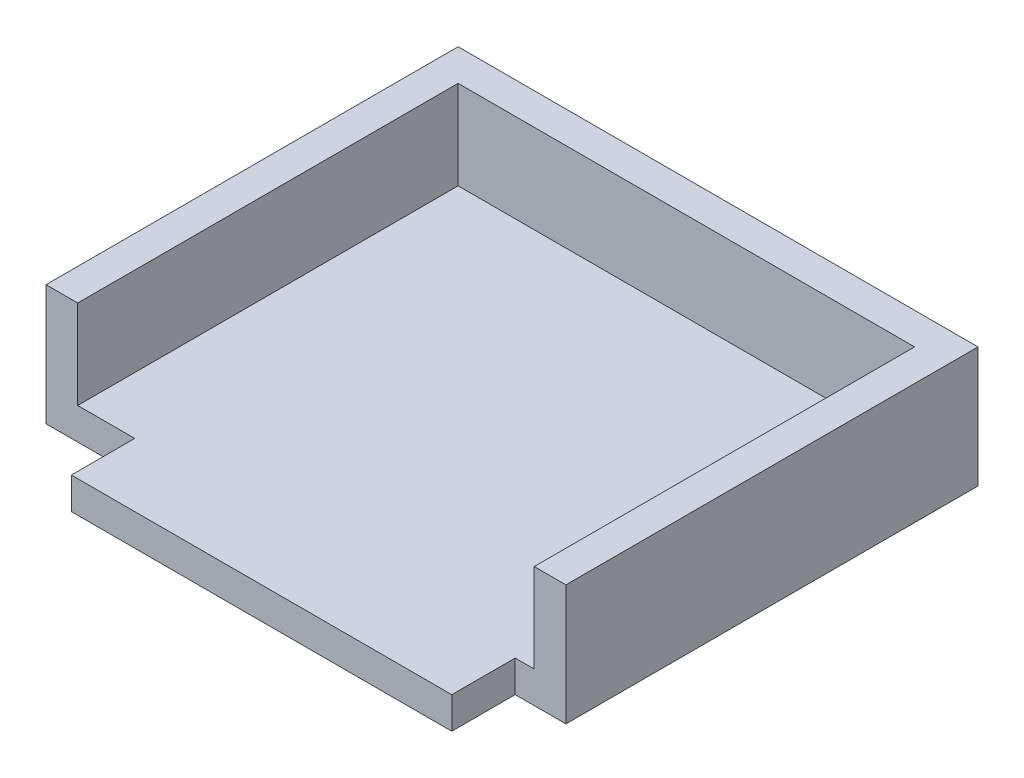
ISO-10303-21;
HEADER;
FILE_DESCRIPTION(('STEP AP214'),'2;1');
FILE_NAME('part.step','',(''),(''),'','','');
FILE_SCHEMA(('AUTOMOTIVE_DESIGN { 1 0 10303 214 1 1 1 1 }'));
ENDSEC;
DATA;
#1=APPLICATION_CONTEXT('core data for automotive mechanical design processes');
#2=APPLICATION_PROTOCOL_DEFINITION('international standard','automotive_design',2000,#1);
#3=PRODUCT_CONTEXT('',#1,'mechanical');
#4=PRODUCT('Part','Part','',(#3));
#5=PRODUCT_RELATED_PRODUCT_CATEGORY('part','',(#4));
#6=PRODUCT_DEFINITION_FORMATION('','',#4);
#7=PRODUCT_DEFINITION_CONTEXT('part definition',#1,'design');
#8=PRODUCT_DEFINITION('design','',#6,#7);
#9=PRODUCT_DEFINITION_SHAPE('','',#8);
#10=(LENGTH_UNIT() NAMED_UNIT(*) SI_UNIT(.MILLI.,.METRE.));
#11=(NAMED_UNIT(*) PLANE_ANGLE_UNIT() SI_UNIT($,.RADIAN.));
#12=(NAMED_UNIT(*) SI_UNIT($,.STERADIAN.) SOLID_ANGLE_UNIT());
#13=UNCERTAINTY_MEASURE_WITH_UNIT(LENGTH_MEASURE(1.E-05),#10,'distance_accuracy_value','');
#14=(GEOMETRIC_REPRESENTATION_CONTEXT(3) GLOBAL_UNCERTAINTY_ASSIGNED_CONTEXT((#13)) GLOBAL_UNIT_ASSIGNED_CONTEXT((#10,
#11,#12)) REPRESENTATION_CONTEXT('',''));
#15=CARTESIAN_POINT('',(0.,0.,0.));
#16=DIRECTION('',(0.,0.,1.));
#17=DIRECTION('',(1.,0.,0.));
#18=AXIS2_PLACEMENT_3D('',#15,#16,#17);
#19=CARTESIAN_POINT('',(-69.1914866211674,5.,-21.8318265199161));
#20=DIRECTION('',(1.,0.,0.));
#21=DIRECTION('',(0.,0.,-1.));
#22=AXIS2_PLACEMENT_3D('',#19,#20,#21);
#23=PLANE('',#22);
#24=DIRECTION('',(0.,0.,1.));
#25=VECTOR('',#24,1.);
#26=CARTESIAN_POINT('',(-69.1914866211674,0.,-21.8318265199161));
#27=LINE('',#26,#25);
#28=CARTESIAN_POINT('',(-69.1914866211674,0.,-21.8318265199161));
#29=VERTEX_POINT('',#28);
#30=CARTESIAN_POINT('',(-69.1914866211674,0.,43.1681734800839));
#31=VERTEX_POINT('',#30);
#32=EDGE_CURVE('E181',#29,#31,#27,.T.);
#33=ORIENTED_EDGE('',*,*,#32,.T.);
#34=DIRECTION('',(0.,-1.,0.));
#35=VECTOR('',#34,1.);
#36=CARTESIAN_POINT('',(-69.1914866211674,5.,43.1681734800839));
#37=LINE('',#36,#35);
#38=CARTESIAN_POINT('',(-69.1914866211674,19.,43.1681734800839));
#39=VERTEX_POINT('',#38);
#40=EDGE_CURVE('E11',#39,#31,#37,.T.);
#41=ORIENTED_EDGE('',*,*,#40,.F.);
#42=DIRECTION('',(0.,0.,1.));
#43=VECTOR('',#42,1.);
#44=CARTESIAN_POINT('',(-69.1914866211674,19.,-21.8318265199161));
#45=LINE('',#44,#43);
#46=CARTESIAN_POINT('',(-69.1914866211674,19.,-21.8318265199161));
#47=VERTEX_POINT('',#46);
#48=EDGE_CURVE('E151',#47,#39,#45,.T.);
#49=ORIENTED_EDGE('',*,*,#48,.F.);
#50=DIRECTION('',(0.,-1.,0.));
#51=VECTOR('',#50,1.);
#52=CARTESIAN_POINT('',(-69.1914866211674,5.,-21.8318265199161));
#53=LINE('',#52,#51);
#54=EDGE_CURVE('E194',#47,#29,#53,.T.);
#55=ORIENTED_EDGE('',*,*,#54,.T.);
#56=EDGE_LOOP('',(#33,#41,#49,#55));
#57=FACE_BOUND('',#56,.T.);
#58=ADVANCED_FACE('F31',(#57),#23,.F.);
#59=CARTESIAN_POINT('',(-69.1914866211674,5.,43.1681734800839));
#60=DIRECTION('',(0.,0.,-1.));
#61=DIRECTION('',(-1.,0.,0.));
#62=AXIS2_PLACEMENT_3D('',#59,#60,#61);
#63=PLANE('',#62);
#64=DIRECTION('',(1.,0.,0.));
#65=VECTOR('',#64,1.);
#66=CARTESIAN_POINT('',(-69.1914866211674,0.,43.1681734800839));
#67=LINE('',#66,#65);
#68=CARTESIAN_POINT('',(-55.1914866211673,0.,43.1681734800839));
#69=VERTEX_POINT('',#68);
#70=EDGE_CURVE('E202',#31,#69,#67,.T.);
#71=ORIENTED_EDGE('',*,*,#70,.T.);
#72=DIRECTION('',(0.,-1.,0.));
#73=VECTOR('',#72,1.);
#74=CARTESIAN_POINT('',(-55.1914866211673,5.,43.1681734800839));
#75=LINE('',#74,#73);
#76=CARTESIAN_POINT('',(-55.1914866211673,5.,43.1681734800839));
#77=VERTEX_POINT('',#76);
#78=EDGE_CURVE('E39',#77,#69,#75,.T.);
#79=ORIENTED_EDGE('',*,*,#78,.F.);
#80=DIRECTION('',(1.,0.,0.));
#81=VECTOR('',#80,1.);
#82=CARTESIAN_POINT('',(-69.1914866211674,5.,43.1681734800839));
#83=LINE('',#82,#81);
#84=CARTESIAN_POINT('',(-64.1914866211673,5.,43.1681734800839));
#85=VERTEX_POINT('',#84);
#86=EDGE_CURVE('E188',#85,#77,#83,.T.);
#87=ORIENTED_EDGE('',*,*,#86,.F.);
#88=DIRECTION('',(0.,-1.,0.));
#89=VECTOR('',#88,1.);
#90=CARTESIAN_POINT('',(-64.1914866211673,19.,43.1681734800839));
#91=LINE('',#90,#89);
#92=CARTESIAN_POINT('',(-64.1914866211673,19.,43.1681734800839));
#93=VERTEX_POINT('',#92);
#94=EDGE_CURVE('E176',#93,#85,#91,.T.);
#95=ORIENTED_EDGE('',*,*,#94,.F.);
#96=DIRECTION('',(1.,0.,0.));
#97=VECTOR('',#96,1.);
#98=CARTESIAN_POINT('',(-69.1914866211674,19.,43.1681734800839));
#99=LINE('',#98,#97);
#100=EDGE_CURVE('E154',#39,#93,#99,.T.);
#101=ORIENTED_EDGE('',*,*,#100,.F.);
#102=ORIENTED_EDGE('',*,*,#40,.T.);
#103=EDGE_LOOP('',(#71,#79,#87,#95,#101,#102));
#104=FACE_BOUND('',#103,.T.);
#105=ADVANCED_FACE('F249',(#104),#63,.F.);
#106=CARTESIAN_POINT('',(-55.1914866211673,5.,43.1681734800839));
#107=DIRECTION('',(1.,0.,0.));
#108=DIRECTION('',(0.,0.,-1.));
#109=AXIS2_PLACEMENT_3D('',#106,#107,#108);
#110=PLANE('',#109);
#111=DIRECTION('',(0.,0.,1.));
#112=VECTOR('',#111,1.);
#113=CARTESIAN_POINT('',(-55.1914866211673,0.,43.1681734800839));
#114=LINE('',#113,#112);
#115=CARTESIAN_POINT('',(-55.1914866211673,0.,53.1681734800839));
#116=VERTEX_POINT('',#115);
#117=EDGE_CURVE('E204',#69,#116,#114,.T.);
#118=ORIENTED_EDGE('',*,*,#117,.T.);
#119=DIRECTION('',(0.,-1.,0.));
#120=VECTOR('',#119,1.);
#121=CARTESIAN_POINT('',(-55.1914866211673,5.,53.1681734800839));
#122=LINE('',#121,#120);
#123=CARTESIAN_POINT('',(-55.1914866211673,5.,53.1681734800839));
#124=VERTEX_POINT('',#123);
#125=EDGE_CURVE('E221',#124,#116,#122,.T.);
#126=ORIENTED_EDGE('',*,*,#125,.F.);
#127=DIRECTION('',(0.,0.,1.));
#128=VECTOR('',#127,1.);
#129=CARTESIAN_POINT('',(-55.1914866211673,5.,43.1681734800839));
#130=LINE('',#129,#128);
#131=EDGE_CURVE('E185',#77,#124,#130,.T.);
#132=ORIENTED_EDGE('',*,*,#131,.F.);
#133=ORIENTED_EDGE('',*,*,#78,.T.);
#134=EDGE_LOOP('',(#118,#126,#132,#133));
#135=FACE_BOUND('',#134,.T.);
#136=ADVANCED_FACE('F228',(#135),#110,.F.);
#137=CARTESIAN_POINT('',(-55.1914866211673,5.,53.1681734800839));
#138=DIRECTION('',(0.,0.,-1.));
#139=DIRECTION('',(-1.,0.,0.));
#140=AXIS2_PLACEMENT_3D('',#137,#138,#139);
#141=PLANE('',#140);
#142=DIRECTION('',(1.,0.,0.));
#143=VECTOR('',#142,1.);
#144=CARTESIAN_POINT('',(-55.1914866211673,0.,53.1681734800839));
#145=LINE('',#144,#143);
#146=CARTESIAN_POINT('',(4.80851337883265,0.,53.1681734800839));
#147=VERTEX_POINT('',#146);
#148=EDGE_CURVE('E206',#116,#147,#145,.T.);
#149=ORIENTED_EDGE('',*,*,#148,.T.);
#150=DIRECTION('',(0.,-1.,0.));
#151=VECTOR('',#150,1.);
#152=CARTESIAN_POINT('',(4.80851337883265,5.,53.1681734800839));
#153=LINE('',#152,#151);
#154=CARTESIAN_POINT('',(4.80851337883265,5.,53.1681734800839));
#155=VERTEX_POINT('',#154);
#156=EDGE_CURVE('E218',#155,#147,#153,.T.);
#157=ORIENTED_EDGE('',*,*,#156,.F.);
#158=DIRECTION('',(1.,0.,0.));
#159=VECTOR('',#158,1.);
#160=CARTESIAN_POINT('',(-55.1914866211673,5.,53.1681734800839));
#161=LINE('',#160,#159);
#162=EDGE_CURVE('E245',#124,#155,#161,.T.);
#163=ORIENTED_EDGE('',*,*,#162,.F.);
#164=ORIENTED_EDGE('',*,*,#125,.T.);
#165=EDGE_LOOP('',(#149,#157,#163,#164));
#166=FACE_BOUND('',#165,.T.);
#167=ADVANCED_FACE('F239',(#166),#141,.F.);
#168=CARTESIAN_POINT('',(4.80851337883265,5.,53.1681734800839));
#169=DIRECTION('',(-1.,0.,0.));
#170=DIRECTION('',(0.,0.,1.));
#171=AXIS2_PLACEMENT_3D('',#168,#169,#170);
#172=PLANE('',#171);
#173=DIRECTION('',(0.,0.,-1.));
#174=VECTOR('',#173,1.);
#175=CARTESIAN_POINT('',(4.80851337883265,0.,53.1681734800839));
#176=LINE('',#175,#174);
#177=CARTESIAN_POINT('',(4.80851337883265,0.,43.1681734800839));
#178=VERTEX_POINT('',#177);
#179=EDGE_CURVE('E208',#147,#178,#176,.T.);
#180=ORIENTED_EDGE('',*,*,#179,.T.);
#181=DIRECTION('',(0.,-1.,0.));
#182=VECTOR('',#181,1.);
#183=CARTESIAN_POINT('',(4.80851337883265,5.,43.1681734800839));
#184=LINE('',#183,#182);
#185=CARTESIAN_POINT('',(4.80851337883265,5.,43.1681734800839));
#186=VERTEX_POINT('',#185);
#187=EDGE_CURVE('E130',#186,#178,#184,.T.);
#188=ORIENTED_EDGE('',*,*,#187,.F.);
#189=DIRECTION('',(0.,0.,-1.));
#190=VECTOR('',#189,1.);
#191=CARTESIAN_POINT('',(4.80851337883265,5.,53.1681734800839));
#192=LINE('',#191,#190);
#193=EDGE_CURVE('E195',#155,#186,#192,.T.);
#194=ORIENTED_EDGE('',*,*,#193,.F.);
#195=ORIENTED_EDGE('',*,*,#156,.T.);
#196=EDGE_LOOP('',(#180,#188,#194,#195));
#197=FACE_BOUND('',#196,.T.);
#198=ADVANCED_FACE('F243',(#197),#172,.F.);
#199=CARTESIAN_POINT('',(4.80851337883265,5.,43.1681734800839));
#200=DIRECTION('',(0.,0.,-1.));
#201=DIRECTION('',(-1.,0.,0.));
#202=AXIS2_PLACEMENT_3D('',#199,#200,#201);
#203=PLANE('',#202);
#204=DIRECTION('',(1.,0.,0.));
#205=VECTOR('',#204,1.);
#206=CARTESIAN_POINT('',(4.80851337883265,0.,43.1681734800839));
#207=LINE('',#206,#205);
#208=CARTESIAN_POINT('',(12.8085133788327,0.,43.1681734800839));
#209=VERTEX_POINT('',#208);
#210=EDGE_CURVE('E127',#178,#209,#207,.T.);
#211=ORIENTED_EDGE('',*,*,#210,.T.);
#212=DIRECTION('',(0.,-1.,0.));
#213=VECTOR('',#212,1.);
#214=CARTESIAN_POINT('',(12.8085133788327,5.,43.1681734800839));
#215=LINE('',#214,#213);
#216=CARTESIAN_POINT('',(12.8085133788327,19.,43.1681734800839));
#217=VERTEX_POINT('',#216);
#218=EDGE_CURVE('E119',#217,#209,#215,.T.);
#219=ORIENTED_EDGE('',*,*,#218,.F.);
#220=DIRECTION('',(1.,0.,0.));
#221=VECTOR('',#220,1.);
#222=CARTESIAN_POINT('',(7.80851337883266,19.,43.1681734800839));
#223=LINE('',#222,#221);
#224=CARTESIAN_POINT('',(7.80851337883266,19.,43.1681734800839));
#225=VERTEX_POINT('',#224);
#226=EDGE_CURVE('E124',#225,#217,#223,.T.);
#227=ORIENTED_EDGE('',*,*,#226,.F.);
#228=DIRECTION('',(0.,-1.,0.));
#229=VECTOR('',#228,1.);
#230=CARTESIAN_POINT('',(7.80851337883266,19.,43.1681734800839));
#231=LINE('',#230,#229);
#232=CARTESIAN_POINT('',(7.80851337883266,5.,43.1681734800839));
#233=VERTEX_POINT('',#232);
#234=EDGE_CURVE('E161',#225,#233,#231,.T.);
#235=ORIENTED_EDGE('',*,*,#234,.T.);
#236=DIRECTION('',(1.,0.,0.));
#237=VECTOR('',#236,1.);
#238=CARTESIAN_POINT('',(4.80851337883265,5.,43.1681734800839));
#239=LINE('',#238,#237);
#240=EDGE_CURVE('E52',#186,#233,#239,.T.);
#241=ORIENTED_EDGE('',*,*,#240,.F.);
#242=ORIENTED_EDGE('',*,*,#187,.T.);
#243=EDGE_LOOP('',(#211,#219,#227,#235,#241,#242));
#244=FACE_BOUND('',#243,.T.);
#245=ADVANCED_FACE('F121',(#244),#203,.F.);
#246=CARTESIAN_POINT('',(12.8085133788327,5.,-21.8318265199161));
#247=DIRECTION('',(-1.,0.,0.));
#248=DIRECTION('',(0.,0.,1.));
#249=AXIS2_PLACEMENT_3D('',#246,#247,#248);
#250=PLANE('',#249);
#251=DIRECTION('',(0.,0.,-1.));
#252=VECTOR('',#251,1.);
#253=CARTESIAN_POINT('',(12.8085133788327,0.,-21.8318265199161));
#254=LINE('',#253,#252);
#255=CARTESIAN_POINT('',(12.8085133788327,0.,-21.8318265199161));
#256=VERTEX_POINT('',#255);
#257=EDGE_CURVE('E211',#209,#256,#254,.T.);
#258=ORIENTED_EDGE('',*,*,#257,.T.);
#259=DIRECTION('',(0.,-1.,0.));
#260=VECTOR('',#259,1.);
#261=CARTESIAN_POINT('',(12.8085133788327,5.,-21.8318265199161));
#262=LINE('',#261,#260);
#263=CARTESIAN_POINT('',(12.8085133788327,19.,-21.8318265199162));
#264=VERTEX_POINT('',#263);
#265=EDGE_CURVE('E131',#264,#256,#262,.T.);
#266=ORIENTED_EDGE('',*,*,#265,.F.);
#267=DIRECTION('',(0.,0.,-1.));
#268=VECTOR('',#267,1.);
#269=CARTESIAN_POINT('',(12.8085133788327,19.,43.1681734800839));
#270=LINE('',#269,#268);
#271=EDGE_CURVE('E134',#217,#264,#270,.T.);
#272=ORIENTED_EDGE('',*,*,#271,.F.);
#273=ORIENTED_EDGE('',*,*,#218,.T.);
#274=EDGE_LOOP('',(#258,#266,#272,#273));
#275=FACE_BOUND('',#274,.T.);
#276=ADVANCED_FACE('F135',(#275),#250,.F.);
#277=CARTESIAN_POINT('',(-69.1914866211674,5.,-21.8318265199161));
#278=DIRECTION('',(0.,0.,1.));
#279=DIRECTION('',(1.,0.,0.));
#280=AXIS2_PLACEMENT_3D('',#277,#278,#279);
#281=PLANE('',#280);
#282=DIRECTION('',(-1.,0.,0.));
#283=VECTOR('',#282,1.);
#284=CARTESIAN_POINT('',(-69.1914866211674,0.,-21.8318265199161));
#285=LINE('',#284,#283);
#286=EDGE_CURVE('E190',#256,#29,#285,.T.);
#287=ORIENTED_EDGE('',*,*,#286,.T.);
#288=ORIENTED_EDGE('',*,*,#54,.F.);
#289=DIRECTION('',(-1.,0.,0.));
#290=VECTOR('',#289,1.);
#291=CARTESIAN_POINT('',(12.8085133788327,19.,-21.8318265199162));
#292=LINE('',#291,#290);
#293=EDGE_CURVE('E140',#264,#47,#292,.T.);
#294=ORIENTED_EDGE('',*,*,#293,.F.);
#295=ORIENTED_EDGE('',*,*,#265,.T.);
#296=EDGE_LOOP('',(#287,#288,#294,#295));
#297=FACE_BOUND('',#296,.T.);
#298=ADVANCED_FACE('F258',(#297),#281,.F.);
#299=CARTESIAN_POINT('',(-69.1914866211674,5.,43.1681734800839));
#300=DIRECTION('',(0.,1.,0.));
#301=DIRECTION('',(0.,0.,1.));
#302=AXIS2_PLACEMENT_3D('',#299,#300,#301);
#303=PLANE('',#302);
#304=DIRECTION('',(0.,0.,1.));
#305=VECTOR('',#304,1.);
#306=CARTESIAN_POINT('',(7.80851337883266,5.,43.1681734800839));
#307=LINE('',#306,#305);
#308=CARTESIAN_POINT('',(7.80851337883265,5.,-16.8318265199161));
#309=VERTEX_POINT('',#308);
#310=EDGE_CURVE('E47',#309,#233,#307,.T.);
#311=ORIENTED_EDGE('',*,*,#310,.F.);
#312=DIRECTION('',(1.,0.,0.));
#313=VECTOR('',#312,1.);
#314=CARTESIAN_POINT('',(7.80851337883265,5.,-16.8318265199161));
#315=LINE('',#314,#313);
#316=CARTESIAN_POINT('',(-64.1914866211673,5.,-16.8318265199161));
#317=VERTEX_POINT('',#316);
#318=EDGE_CURVE('E147',#317,#309,#315,.T.);
#319=ORIENTED_EDGE('',*,*,#318,.F.);
#320=DIRECTION('',(0.,0.,-1.));
#321=VECTOR('',#320,1.);
#322=CARTESIAN_POINT('',(-64.1914866211673,5.,-16.8318265199161));
#323=LINE('',#322,#321);
#324=EDGE_CURVE('E163',#85,#317,#323,.T.);
#325=ORIENTED_EDGE('',*,*,#324,.F.);
#326=ORIENTED_EDGE('',*,*,#86,.T.);
#327=ORIENTED_EDGE('',*,*,#131,.T.);
#328=ORIENTED_EDGE('',*,*,#162,.T.);
#329=ORIENTED_EDGE('',*,*,#193,.T.);
#330=ORIENTED_EDGE('',*,*,#240,.T.);
#331=EDGE_LOOP('',(#311,#319,#325,#326,#327,#328,#329,#330));
#332=FACE_BOUND('',#331,.T.);
#333=ADVANCED_FACE('F246',(#332),#303,.T.);
#334=CARTESIAN_POINT('',(-69.1914866211674,0.,43.1681734800839));
#335=DIRECTION('',(0.,1.,0.));
#336=DIRECTION('',(0.,0.,1.));
#337=AXIS2_PLACEMENT_3D('',#334,#335,#336);
#338=PLANE('',#337);
#339=ORIENTED_EDGE('',*,*,#32,.F.);
#340=ORIENTED_EDGE('',*,*,#286,.F.);
#341=ORIENTED_EDGE('',*,*,#257,.F.);
#342=ORIENTED_EDGE('',*,*,#210,.F.);
#343=ORIENTED_EDGE('',*,*,#179,.F.);
#344=ORIENTED_EDGE('',*,*,#148,.F.);
#345=ORIENTED_EDGE('',*,*,#117,.F.);
#346=ORIENTED_EDGE('',*,*,#70,.F.);
#347=EDGE_LOOP('',(#339,#340,#341,#342,#343,#344,#345,#346));
#348=FACE_BOUND('',#347,.T.);
#349=ADVANCED_FACE('F235',(#348),#338,.F.);
#350=CARTESIAN_POINT('',(-64.1914866211673,19.,-16.8318265199161));
#351=DIRECTION('',(-1.,0.,0.));
#352=DIRECTION('',(0.,0.,1.));
#353=AXIS2_PLACEMENT_3D('',#350,#351,#352);
#354=PLANE('',#353);
#355=ORIENTED_EDGE('',*,*,#324,.T.);
#356=DIRECTION('',(0.,-1.,0.));
#357=VECTOR('',#356,1.);
#358=CARTESIAN_POINT('',(-64.1914866211673,19.,-16.8318265199161));
#359=LINE('',#358,#357);
#360=CARTESIAN_POINT('',(-64.1914866211673,19.,-16.8318265199161));
#361=VERTEX_POINT('',#360);
#362=EDGE_CURVE('E172',#361,#317,#359,.T.);
#363=ORIENTED_EDGE('',*,*,#362,.F.);
#364=DIRECTION('',(0.,0.,-1.));
#365=VECTOR('',#364,1.);
#366=CARTESIAN_POINT('',(-64.1914866211673,19.,-16.8318265199161));
#367=LINE('',#366,#365);
#368=EDGE_CURVE('E156',#93,#361,#367,.T.);
#369=ORIENTED_EDGE('',*,*,#368,.F.);
#370=ORIENTED_EDGE('',*,*,#94,.T.);
#371=EDGE_LOOP('',(#355,#363,#369,#370));
#372=FACE_BOUND('',#371,.T.);
#373=ADVANCED_FACE('F253',(#372),#354,.F.);
#374=CARTESIAN_POINT('',(7.80851337883265,19.,-16.8318265199161));
#375=DIRECTION('',(0.,0.,-1.));
#376=DIRECTION('',(-1.,0.,0.));
#377=AXIS2_PLACEMENT_3D('',#374,#375,#376);
#378=PLANE('',#377);
#379=ORIENTED_EDGE('',*,*,#318,.T.);
#380=DIRECTION('',(0.,-1.,0.));
#381=VECTOR('',#380,1.);
#382=CARTESIAN_POINT('',(7.80851337883265,19.,-16.8318265199161));
#383=LINE('',#382,#381);
#384=CARTESIAN_POINT('',(7.80851337883265,19.,-16.8318265199161));
#385=VERTEX_POINT('',#384);
#386=EDGE_CURVE('E166',#385,#309,#383,.T.);
#387=ORIENTED_EDGE('',*,*,#386,.F.);
#388=DIRECTION('',(1.,0.,0.));
#389=VECTOR('',#388,1.);
#390=CARTESIAN_POINT('',(7.80851337883265,19.,-16.8318265199161));
#391=LINE('',#390,#389);
#392=EDGE_CURVE('E158',#361,#385,#391,.T.);
#393=ORIENTED_EDGE('',*,*,#392,.F.);
#394=ORIENTED_EDGE('',*,*,#362,.T.);
#395=EDGE_LOOP('',(#379,#387,#393,#394));
#396=FACE_BOUND('',#395,.T.);
#397=ADVANCED_FACE('F313',(#396),#378,.F.);
#398=CARTESIAN_POINT('',(7.80851337883266,19.,43.1681734800839));
#399=DIRECTION('',(1.,0.,0.));
#400=DIRECTION('',(0.,0.,-1.));
#401=AXIS2_PLACEMENT_3D('',#398,#399,#400);
#402=PLANE('',#401);
#403=ORIENTED_EDGE('',*,*,#310,.T.);
#404=ORIENTED_EDGE('',*,*,#234,.F.);
#405=DIRECTION('',(0.,0.,1.));
#406=VECTOR('',#405,1.);
#407=CARTESIAN_POINT('',(7.80851337883266,19.,43.1681734800839));
#408=LINE('',#407,#406);
#409=EDGE_CURVE('E144',#385,#225,#408,.T.);
#410=ORIENTED_EDGE('',*,*,#409,.F.);
#411=ORIENTED_EDGE('',*,*,#386,.T.);
#412=EDGE_LOOP('',(#403,#404,#410,#411));
#413=FACE_BOUND('',#412,.T.);
#414=ADVANCED_FACE('F322',(#413),#402,.F.);
#415=CARTESIAN_POINT('',(12.8085133788327,19.,43.1681734800839));
#416=DIRECTION('',(0.,1.,0.));
#417=DIRECTION('',(0.,0.,1.));
#418=AXIS2_PLACEMENT_3D('',#415,#416,#417);
#419=PLANE('',#418);
#420=ORIENTED_EDGE('',*,*,#226,.T.);
#421=ORIENTED_EDGE('',*,*,#271,.T.);
#422=ORIENTED_EDGE('',*,*,#293,.T.);
#423=ORIENTED_EDGE('',*,*,#48,.T.);
#424=ORIENTED_EDGE('',*,*,#100,.T.);
#425=ORIENTED_EDGE('',*,*,#368,.T.);
#426=ORIENTED_EDGE('',*,*,#392,.T.);
#427=ORIENTED_EDGE('',*,*,#409,.T.);
#428=EDGE_LOOP('',(#420,#421,#422,#423,#424,#425,#426,#427));
#429=FACE_BOUND('',#428,.T.);
#430=ADVANCED_FACE('F142',(#429),#419,.T.);
#431=CLOSED_SHELL('',(#58,#105,#136,#167,#198,#245,#276,#298,#333,#349,#373,#397,#414,#430));
#432=MANIFOLD_SOLID_BREP('B2',#431);
#433=ADVANCED_BREP_SHAPE_REPRESENTATION('',(#18,#432),#14);
#434=SHAPE_DEFINITION_REPRESENTATION(#9,#433);
ENDSEC;
END-ISO-10303-21;
